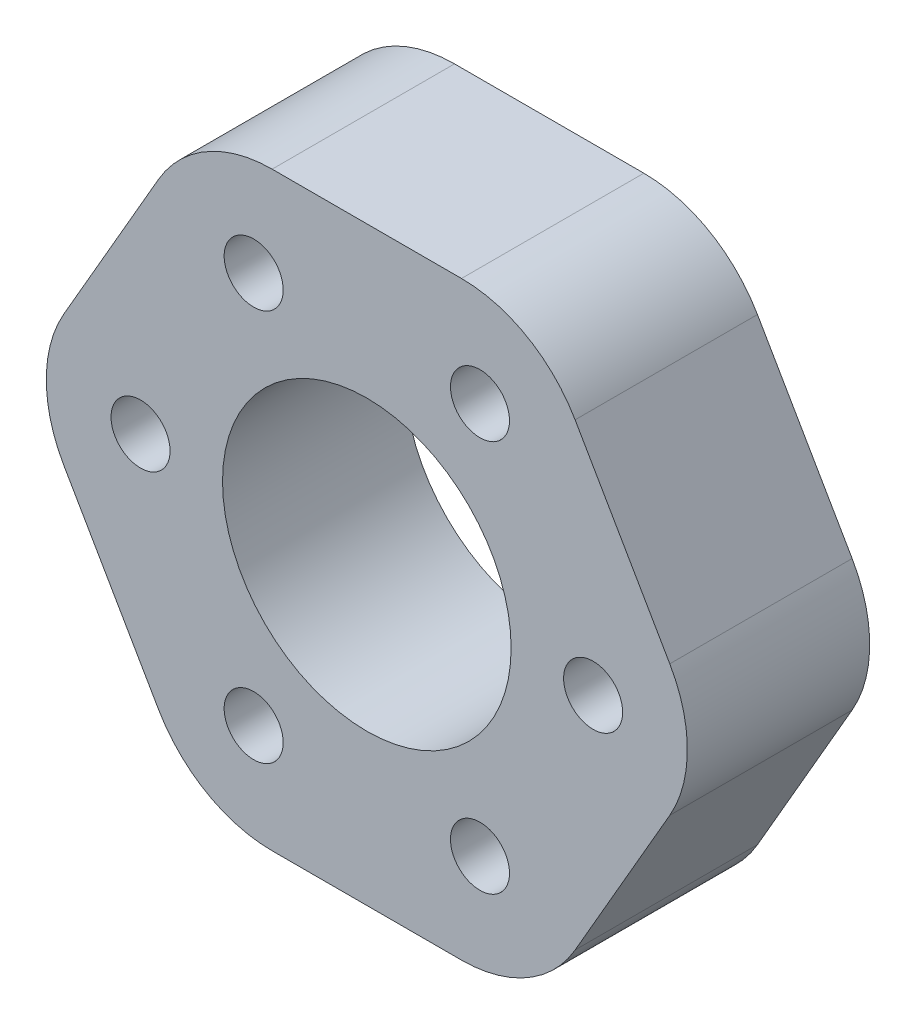
ISO-10303-21;
HEADER;
FILE_DESCRIPTION(('STEP AP214'),'2;1');
FILE_NAME('part.step','',(''),(''),'','','');
FILE_SCHEMA(('AUTOMOTIVE_DESIGN { 1 0 10303 214 1 1 1 1 }'));
ENDSEC;
DATA;
#1=APPLICATION_CONTEXT('core data for automotive mechanical design processes');
#2=APPLICATION_PROTOCOL_DEFINITION('international standard','automotive_design',2000,#1);
#3=PRODUCT_CONTEXT('',#1,'mechanical');
#4=PRODUCT('Part','Part','',(#3));
#5=PRODUCT_RELATED_PRODUCT_CATEGORY('part','',(#4));
#6=PRODUCT_DEFINITION_FORMATION('','',#4);
#7=PRODUCT_DEFINITION_CONTEXT('part definition',#1,'design');
#8=PRODUCT_DEFINITION('design','',#6,#7);
#9=PRODUCT_DEFINITION_SHAPE('','',#8);
#10=(LENGTH_UNIT() NAMED_UNIT(*) SI_UNIT(.MILLI.,.METRE.));
#11=(NAMED_UNIT(*) PLANE_ANGLE_UNIT() SI_UNIT($,.RADIAN.));
#12=(NAMED_UNIT(*) SI_UNIT($,.STERADIAN.) SOLID_ANGLE_UNIT());
#13=UNCERTAINTY_MEASURE_WITH_UNIT(LENGTH_MEASURE(1.E-05),#10,'distance_accuracy_value','');
#14=(GEOMETRIC_REPRESENTATION_CONTEXT(3) GLOBAL_UNCERTAINTY_ASSIGNED_CONTEXT((#13)) GLOBAL_UNIT_ASSIGNED_CONTEXT((#10,
#11,#12)) REPRESENTATION_CONTEXT('',''));
#15=CARTESIAN_POINT('',(0.,0.,0.));
#16=DIRECTION('',(0.,0.,1.));
#17=DIRECTION('',(1.,0.,0.));
#18=AXIS2_PLACEMENT_3D('',#15,#16,#17);
#19=CARTESIAN_POINT('',(0.,0.,13.9));
#20=DIRECTION('',(0.,0.,1.));
#21=DIRECTION('',(1.,0.,0.));
#22=AXIS2_PLACEMENT_3D('',#19,#20,#21);
#23=PLANE('',#22);
#24=CARTESIAN_POINT('',(-8.62500000000017,-14.9389382152815,13.9));
#25=DIRECTION('',(0.,0.,1.));
#26=DIRECTION('',(1.,0.,0.));
#27=AXIS2_PLACEMENT_3D('',#24,#25,#26);
#28=CIRCLE('',#27,2.25);
#29=CARTESIAN_POINT('',(-6.37500000000017,-14.9389382152815,13.9));
#30=VERTEX_POINT('',#29);
#31=EDGE_CURVE('E268',#30,#30,#28,.T.);
#32=ORIENTED_EDGE('',*,*,#31,.F.);
#33=EDGE_LOOP('',(#32));
#34=FACE_BOUND('',#33,.T.);
#35=CARTESIAN_POINT('',(17.25,-1.20456106190088E-13,13.9));
#36=DIRECTION('',(0.,0.,1.));
#37=DIRECTION('',(1.,0.,0.));
#38=AXIS2_PLACEMENT_3D('',#35,#36,#37);
#39=CIRCLE('',#38,2.25);
#40=CARTESIAN_POINT('',(19.5,-1.20456106190088E-13,13.9));
#41=VERTEX_POINT('',#40);
#42=EDGE_CURVE('E284',#41,#41,#39,.T.);
#43=ORIENTED_EDGE('',*,*,#42,.F.);
#44=EDGE_LOOP('',(#43));
#45=FACE_BOUND('',#44,.T.);
#46=CARTESIAN_POINT('',(-8.62499999999997,14.9389382152816,13.9));
#47=DIRECTION('',(0.,0.,1.));
#48=DIRECTION('',(1.,0.,0.));
#49=AXIS2_PLACEMENT_3D('',#46,#47,#48);
#50=CIRCLE('',#49,2.25);
#51=CARTESIAN_POINT('',(-6.37499999999997,14.9389382152816,13.9));
#52=VERTEX_POINT('',#51);
#53=EDGE_CURVE('E300',#52,#52,#50,.T.);
#54=ORIENTED_EDGE('',*,*,#53,.F.);
#55=EDGE_LOOP('',(#54));
#56=FACE_BOUND('',#55,.T.);
#57=CARTESIAN_POINT('',(-17.25,0.,13.9));
#58=DIRECTION('',(0.,0.,1.));
#59=DIRECTION('',(1.,0.,0.));
#60=AXIS2_PLACEMENT_3D('',#57,#58,#59);
#61=CIRCLE('',#60,2.25);
#62=CARTESIAN_POINT('',(-15.,0.,13.9));
#63=VERTEX_POINT('',#62);
#64=EDGE_CURVE('E165',#63,#63,#61,.T.);
#65=ORIENTED_EDGE('',*,*,#64,.F.);
#66=EDGE_LOOP('',(#65));
#67=FACE_BOUND('',#66,.T.);
#68=CARTESIAN_POINT('',(8.62500000000007,14.9389382152815,13.9));
#69=DIRECTION('',(0.,0.,1.));
#70=DIRECTION('',(1.,0.,0.));
#71=AXIS2_PLACEMENT_3D('',#68,#69,#70);
#72=CIRCLE('',#71,2.25);
#73=CARTESIAN_POINT('',(10.8750000000001,14.9389382152815,13.9));
#74=VERTEX_POINT('',#73);
#75=EDGE_CURVE('E292',#74,#74,#72,.T.);
#76=ORIENTED_EDGE('',*,*,#75,.F.);
#77=EDGE_LOOP('',(#76));
#78=FACE_BOUND('',#77,.T.);
#79=CARTESIAN_POINT('',(8.62499999999986,-14.9389382152817,13.9));
#80=DIRECTION('',(0.,0.,1.));
#81=DIRECTION('',(1.,0.,0.));
#82=AXIS2_PLACEMENT_3D('',#79,#80,#81);
#83=CIRCLE('',#82,2.25);
#84=CARTESIAN_POINT('',(10.8749999999999,-14.9389382152817,13.9));
#85=VERTEX_POINT('',#84);
#86=EDGE_CURVE('E276',#85,#85,#83,.T.);
#87=ORIENTED_EDGE('',*,*,#86,.F.);
#88=EDGE_LOOP('',(#87));
#89=FACE_BOUND('',#88,.T.);
#90=CARTESIAN_POINT('',(0.,0.,13.9));
#91=DIRECTION('',(0.,0.,1.));
#92=DIRECTION('',(1.,0.,0.));
#93=AXIS2_PLACEMENT_3D('',#90,#91,#92);
#94=CIRCLE('',#93,11.);
#95=CARTESIAN_POINT('',(11.,0.,13.9));
#96=VERTEX_POINT('',#95);
#97=EDGE_CURVE('E158',#96,#96,#94,.T.);
#98=ORIENTED_EDGE('',*,*,#97,.F.);
#99=EDGE_LOOP('',(#98));
#100=FACE_BOUND('',#99,.T.);
#101=DIRECTION('',(-0.5,0.866025403784438,0.));
#102=VECTOR('',#101,1.);
#103=CARTESIAN_POINT('',(25.9807621135332,0.,13.9));
#104=LINE('',#103,#102);
#105=CARTESIAN_POINT('',(23.094010767585,5.00000000000002,13.9));
#106=VERTEX_POINT('',#105);
#107=CARTESIAN_POINT('',(15.8771324027147,17.5,13.9));
#108=VERTEX_POINT('',#107);
#109=EDGE_CURVE('E138',#106,#108,#104,.T.);
#110=ORIENTED_EDGE('',*,*,#109,.T.);
#111=CARTESIAN_POINT('',(7.21687836487032,12.5,13.9));
#112=DIRECTION('',(0.,0.,1.));
#113=DIRECTION('',(1.,0.,0.));
#114=AXIS2_PLACEMENT_3D('',#111,#112,#113);
#115=CIRCLE('',#114,10.);
#116=CARTESIAN_POINT('',(7.21687836487032,22.5,13.9));
#117=VERTEX_POINT('',#116);
#118=EDGE_CURVE('E185',#108,#117,#115,.T.);
#119=ORIENTED_EDGE('',*,*,#118,.T.);
#120=DIRECTION('',(-1.,0.,0.));
#121=VECTOR('',#120,1.);
#122=CARTESIAN_POINT('',(12.9903810567666,22.5,13.9));
#123=LINE('',#122,#121);
#124=CARTESIAN_POINT('',(-7.21687836487031,22.5,13.9));
#125=VERTEX_POINT('',#124);
#126=EDGE_CURVE('E159',#117,#125,#123,.T.);
#127=ORIENTED_EDGE('',*,*,#126,.T.);
#128=CARTESIAN_POINT('',(-7.21687836487032,12.5,13.9));
#129=DIRECTION('',(0.,0.,1.));
#130=DIRECTION('',(1.,0.,0.));
#131=AXIS2_PLACEMENT_3D('',#128,#129,#130);
#132=CIRCLE('',#131,10.);
#133=CARTESIAN_POINT('',(-15.8771324027147,17.5,13.9));
#134=VERTEX_POINT('',#133);
#135=EDGE_CURVE('E182',#125,#134,#132,.T.);
#136=ORIENTED_EDGE('',*,*,#135,.T.);
#137=DIRECTION('',(-0.5,-0.866025403784439,0.));
#138=VECTOR('',#137,1.);
#139=CARTESIAN_POINT('',(-12.9903810567666,22.5,13.9));
#140=LINE('',#139,#138);
#141=CARTESIAN_POINT('',(-23.094010767585,5.,13.9));
#142=VERTEX_POINT('',#141);
#143=EDGE_CURVE('E375',#134,#142,#140,.T.);
#144=ORIENTED_EDGE('',*,*,#143,.T.);
#145=CARTESIAN_POINT('',(-14.4337567297406,0.,13.9));
#146=DIRECTION('',(0.,0.,1.));
#147=DIRECTION('',(1.,0.,0.));
#148=AXIS2_PLACEMENT_3D('',#145,#146,#147);
#149=CIRCLE('',#148,10.);
#150=CARTESIAN_POINT('',(-23.094010767585,-4.99999999999999,13.9));
#151=VERTEX_POINT('',#150);
#152=EDGE_CURVE('E179',#142,#151,#149,.T.);
#153=ORIENTED_EDGE('',*,*,#152,.T.);
#154=DIRECTION('',(0.5,-0.866025403784439,0.));
#155=VECTOR('',#154,1.);
#156=CARTESIAN_POINT('',(-25.9807621135332,0.,13.9));
#157=LINE('',#156,#155);
#158=CARTESIAN_POINT('',(-15.8771324027147,-17.5,13.9));
#159=VERTEX_POINT('',#158);
#160=EDGE_CURVE('E371',#151,#159,#157,.T.);
#161=ORIENTED_EDGE('',*,*,#160,.T.);
#162=CARTESIAN_POINT('',(-7.21687836487032,-12.5,13.9));
#163=DIRECTION('',(0.,0.,1.));
#164=DIRECTION('',(1.,0.,0.));
#165=AXIS2_PLACEMENT_3D('',#162,#163,#164);
#166=CIRCLE('',#165,10.);
#167=CARTESIAN_POINT('',(-7.21687836487032,-22.5,13.9));
#168=VERTEX_POINT('',#167);
#169=EDGE_CURVE('E147',#159,#168,#166,.T.);
#170=ORIENTED_EDGE('',*,*,#169,.T.);
#171=DIRECTION('',(1.,0.,0.));
#172=VECTOR('',#171,1.);
#173=CARTESIAN_POINT('',(-12.9903810567666,-22.5,13.9));
#174=LINE('',#173,#172);
#175=CARTESIAN_POINT('',(7.21687836487032,-22.5,13.9));
#176=VERTEX_POINT('',#175);
#177=EDGE_CURVE('E381',#168,#176,#174,.T.);
#178=ORIENTED_EDGE('',*,*,#177,.T.);
#179=CARTESIAN_POINT('',(7.21687836487032,-12.5,13.9));
#180=DIRECTION('',(0.,0.,1.));
#181=DIRECTION('',(1.,0.,0.));
#182=AXIS2_PLACEMENT_3D('',#179,#180,#181);
#183=CIRCLE('',#182,10.);
#184=CARTESIAN_POINT('',(15.8771324027147,-17.5,13.9));
#185=VERTEX_POINT('',#184);
#186=EDGE_CURVE('E146',#176,#185,#183,.T.);
#187=ORIENTED_EDGE('',*,*,#186,.T.);
#188=DIRECTION('',(0.5,0.866025403784439,0.));
#189=VECTOR('',#188,1.);
#190=CARTESIAN_POINT('',(12.9903810567666,-22.5,13.9));
#191=LINE('',#190,#189);
#192=CARTESIAN_POINT('',(23.094010767585,-4.99999999999999,13.9));
#193=VERTEX_POINT('',#192);
#194=EDGE_CURVE('E140',#185,#193,#191,.T.);
#195=ORIENTED_EDGE('',*,*,#194,.T.);
#196=CARTESIAN_POINT('',(14.4337567297406,0.,13.9));
#197=DIRECTION('',(0.,0.,1.));
#198=DIRECTION('',(1.,0.,0.));
#199=AXIS2_PLACEMENT_3D('',#196,#197,#198);
#200=CIRCLE('',#199,10.);
#201=EDGE_CURVE('E136',#193,#106,#200,.T.);
#202=ORIENTED_EDGE('',*,*,#201,.T.);
#203=EDGE_LOOP('',(#110,#119,#127,#136,#144,#153,#161,#170,#178,#187,#195,#202));
#204=FACE_BOUND('',#203,.T.);
#205=ADVANCED_FACE('F45',(#34,#45,#56,#67,#78,#89,#100,#204),#23,.T.);
#206=CARTESIAN_POINT('',(0.,0.,0.));
#207=DIRECTION('',(0.,0.,1.));
#208=DIRECTION('',(1.,0.,0.));
#209=AXIS2_PLACEMENT_3D('',#206,#207,#208);
#210=PLANE('',#209);
#211=CARTESIAN_POINT('',(-8.62500000000017,-14.9389382152815,0.));
#212=DIRECTION('',(0.,0.,1.));
#213=DIRECTION('',(1.,0.,0.));
#214=AXIS2_PLACEMENT_3D('',#211,#212,#213);
#215=CIRCLE('',#214,2.25);
#216=CARTESIAN_POINT('',(-6.37500000000017,-14.9389382152815,0.));
#217=VERTEX_POINT('',#216);
#218=EDGE_CURVE('E264',#217,#217,#215,.T.);
#219=ORIENTED_EDGE('',*,*,#218,.T.);
#220=EDGE_LOOP('',(#219));
#221=FACE_BOUND('',#220,.T.);
#222=CARTESIAN_POINT('',(8.62499999999986,-14.9389382152817,0.));
#223=DIRECTION('',(0.,0.,1.));
#224=DIRECTION('',(1.,0.,0.));
#225=AXIS2_PLACEMENT_3D('',#222,#223,#224);
#226=CIRCLE('',#225,2.25);
#227=CARTESIAN_POINT('',(10.8749999999999,-14.9389382152817,0.));
#228=VERTEX_POINT('',#227);
#229=EDGE_CURVE('E272',#228,#228,#226,.T.);
#230=ORIENTED_EDGE('',*,*,#229,.T.);
#231=EDGE_LOOP('',(#230));
#232=FACE_BOUND('',#231,.T.);
#233=CARTESIAN_POINT('',(17.25,-1.20456106190088E-13,0.));
#234=DIRECTION('',(0.,0.,1.));
#235=DIRECTION('',(1.,0.,0.));
#236=AXIS2_PLACEMENT_3D('',#233,#234,#235);
#237=CIRCLE('',#236,2.25);
#238=CARTESIAN_POINT('',(19.5,-1.20456106190088E-13,0.));
#239=VERTEX_POINT('',#238);
#240=EDGE_CURVE('E280',#239,#239,#237,.T.);
#241=ORIENTED_EDGE('',*,*,#240,.T.);
#242=EDGE_LOOP('',(#241));
#243=FACE_BOUND('',#242,.T.);
#244=CARTESIAN_POINT('',(8.62500000000007,14.9389382152815,0.));
#245=DIRECTION('',(0.,0.,1.));
#246=DIRECTION('',(1.,0.,0.));
#247=AXIS2_PLACEMENT_3D('',#244,#245,#246);
#248=CIRCLE('',#247,2.25);
#249=CARTESIAN_POINT('',(10.8750000000001,14.9389382152815,0.));
#250=VERTEX_POINT('',#249);
#251=EDGE_CURVE('E288',#250,#250,#248,.T.);
#252=ORIENTED_EDGE('',*,*,#251,.T.);
#253=EDGE_LOOP('',(#252));
#254=FACE_BOUND('',#253,.T.);
#255=CARTESIAN_POINT('',(-8.62499999999997,14.9389382152816,0.));
#256=DIRECTION('',(0.,0.,1.));
#257=DIRECTION('',(1.,0.,0.));
#258=AXIS2_PLACEMENT_3D('',#255,#256,#257);
#259=CIRCLE('',#258,2.25);
#260=CARTESIAN_POINT('',(-6.37499999999997,14.9389382152816,0.));
#261=VERTEX_POINT('',#260);
#262=EDGE_CURVE('E296',#261,#261,#259,.T.);
#263=ORIENTED_EDGE('',*,*,#262,.T.);
#264=EDGE_LOOP('',(#263));
#265=FACE_BOUND('',#264,.T.);
#266=CARTESIAN_POINT('',(-17.25,0.,0.));
#267=DIRECTION('',(0.,0.,1.));
#268=DIRECTION('',(1.,0.,0.));
#269=AXIS2_PLACEMENT_3D('',#266,#267,#268);
#270=CIRCLE('',#269,2.25);
#271=CARTESIAN_POINT('',(-15.,0.,0.));
#272=VERTEX_POINT('',#271);
#273=EDGE_CURVE('E171',#272,#272,#270,.T.);
#274=ORIENTED_EDGE('',*,*,#273,.T.);
#275=EDGE_LOOP('',(#274));
#276=FACE_BOUND('',#275,.T.);
#277=CARTESIAN_POINT('',(0.,0.,0.));
#278=DIRECTION('',(0.,0.,1.));
#279=DIRECTION('',(1.,0.,0.));
#280=AXIS2_PLACEMENT_3D('',#277,#278,#279);
#281=CIRCLE('',#280,11.);
#282=CARTESIAN_POINT('',(11.,0.,0.));
#283=VERTEX_POINT('',#282);
#284=EDGE_CURVE('E260',#283,#283,#281,.T.);
#285=ORIENTED_EDGE('',*,*,#284,.T.);
#286=EDGE_LOOP('',(#285));
#287=FACE_BOUND('',#286,.T.);
#288=DIRECTION('',(-1.,0.,0.));
#289=VECTOR('',#288,1.);
#290=CARTESIAN_POINT('',(12.9903810567666,22.5,0.));
#291=LINE('',#290,#289);
#292=CARTESIAN_POINT('',(7.21687836487032,22.5,0.));
#293=VERTEX_POINT('',#292);
#294=CARTESIAN_POINT('',(-7.21687836487031,22.5,0.));
#295=VERTEX_POINT('',#294);
#296=EDGE_CURVE('E253',#293,#295,#291,.T.);
#297=ORIENTED_EDGE('',*,*,#296,.F.);
#298=CARTESIAN_POINT('',(7.21687836487032,12.5,0.));
#299=DIRECTION('',(0.,0.,1.));
#300=DIRECTION('',(1.,0.,0.));
#301=AXIS2_PLACEMENT_3D('',#298,#299,#300);
#302=CIRCLE('',#301,10.);
#303=CARTESIAN_POINT('',(15.8771324027147,17.5,0.));
#304=VERTEX_POINT('',#303);
#305=EDGE_CURVE('E208',#293,#304,#302,.F.);
#306=ORIENTED_EDGE('',*,*,#305,.T.);
#307=DIRECTION('',(-0.5,0.866025403784438,0.));
#308=VECTOR('',#307,1.);
#309=CARTESIAN_POINT('',(25.9807621135332,0.,0.));
#310=LINE('',#309,#308);
#311=CARTESIAN_POINT('',(23.094010767585,5.00000000000002,0.));
#312=VERTEX_POINT('',#311);
#313=EDGE_CURVE('E257',#312,#304,#310,.T.);
#314=ORIENTED_EDGE('',*,*,#313,.F.);
#315=CARTESIAN_POINT('',(14.4337567297406,0.,0.));
#316=DIRECTION('',(0.,0.,1.));
#317=DIRECTION('',(1.,0.,0.));
#318=AXIS2_PLACEMENT_3D('',#315,#316,#317);
#319=CIRCLE('',#318,10.);
#320=CARTESIAN_POINT('',(23.094010767585,-4.99999999999999,0.));
#321=VERTEX_POINT('',#320);
#322=EDGE_CURVE('E163',#312,#321,#319,.F.);
#323=ORIENTED_EDGE('',*,*,#322,.T.);
#324=DIRECTION('',(0.5,0.866025403784439,0.));
#325=VECTOR('',#324,1.);
#326=CARTESIAN_POINT('',(12.9903810567666,-22.5,0.));
#327=LINE('',#326,#325);
#328=CARTESIAN_POINT('',(15.8771324027147,-17.5,0.));
#329=VERTEX_POINT('',#328);
#330=EDGE_CURVE('E236',#329,#321,#327,.T.);
#331=ORIENTED_EDGE('',*,*,#330,.F.);
#332=CARTESIAN_POINT('',(7.21687836487032,-12.5,0.));
#333=DIRECTION('',(0.,0.,1.));
#334=DIRECTION('',(1.,0.,0.));
#335=AXIS2_PLACEMENT_3D('',#332,#333,#334);
#336=CIRCLE('',#335,10.);
#337=CARTESIAN_POINT('',(7.21687836487032,-22.5,0.));
#338=VERTEX_POINT('',#337);
#339=EDGE_CURVE('E200',#329,#338,#336,.F.);
#340=ORIENTED_EDGE('',*,*,#339,.T.);
#341=DIRECTION('',(1.,0.,0.));
#342=VECTOR('',#341,1.);
#343=CARTESIAN_POINT('',(-12.9903810567666,-22.5,0.));
#344=LINE('',#343,#342);
#345=CARTESIAN_POINT('',(-7.21687836487032,-22.5,0.));
#346=VERTEX_POINT('',#345);
#347=EDGE_CURVE('E239',#346,#338,#344,.T.);
#348=ORIENTED_EDGE('',*,*,#347,.F.);
#349=CARTESIAN_POINT('',(-7.21687836487032,-12.5,0.));
#350=DIRECTION('',(0.,0.,1.));
#351=DIRECTION('',(1.,0.,0.));
#352=AXIS2_PLACEMENT_3D('',#349,#350,#351);
#353=CIRCLE('',#352,10.);
#354=CARTESIAN_POINT('',(-15.8771324027147,-17.5,0.));
#355=VERTEX_POINT('',#354);
#356=EDGE_CURVE('E195',#346,#355,#353,.F.);
#357=ORIENTED_EDGE('',*,*,#356,.T.);
#358=DIRECTION('',(0.5,-0.866025403784439,0.));
#359=VECTOR('',#358,1.);
#360=CARTESIAN_POINT('',(-25.9807621135332,0.,0.));
#361=LINE('',#360,#359);
#362=CARTESIAN_POINT('',(-23.094010767585,-4.99999999999999,0.));
#363=VERTEX_POINT('',#362);
#364=EDGE_CURVE('E243',#363,#355,#361,.T.);
#365=ORIENTED_EDGE('',*,*,#364,.F.);
#366=CARTESIAN_POINT('',(-14.4337567297406,0.,0.));
#367=DIRECTION('',(0.,0.,1.));
#368=DIRECTION('',(1.,0.,0.));
#369=AXIS2_PLACEMENT_3D('',#366,#367,#368);
#370=CIRCLE('',#369,10.);
#371=CARTESIAN_POINT('',(-23.094010767585,5.,0.));
#372=VERTEX_POINT('',#371);
#373=EDGE_CURVE('E61',#363,#372,#370,.F.);
#374=ORIENTED_EDGE('',*,*,#373,.T.);
#375=DIRECTION('',(-0.5,-0.866025403784439,0.));
#376=VECTOR('',#375,1.);
#377=CARTESIAN_POINT('',(-12.9903810567666,22.5,0.));
#378=LINE('',#377,#376);
#379=CARTESIAN_POINT('',(-15.8771324027147,17.5,0.));
#380=VERTEX_POINT('',#379);
#381=EDGE_CURVE('E250',#380,#372,#378,.T.);
#382=ORIENTED_EDGE('',*,*,#381,.F.);
#383=CARTESIAN_POINT('',(-7.21687836487032,12.5,0.));
#384=DIRECTION('',(0.,0.,1.));
#385=DIRECTION('',(1.,0.,0.));
#386=AXIS2_PLACEMENT_3D('',#383,#384,#385);
#387=CIRCLE('',#386,10.);
#388=EDGE_CURVE('E205',#380,#295,#387,.F.);
#389=ORIENTED_EDGE('',*,*,#388,.T.);
#390=EDGE_LOOP('',(#297,#306,#314,#323,#331,#340,#348,#357,#365,#374,#382,#389));
#391=FACE_BOUND('',#390,.T.);
#392=ADVANCED_FACE('F308',(#221,#232,#243,#254,#265,#276,#287,#391),#210,.F.);
#393=CARTESIAN_POINT('',(-17.25,0.,13.9));
#394=DIRECTION('',(0.,0.,-1.));
#395=DIRECTION('',(-1.,0.,0.));
#396=AXIS2_PLACEMENT_3D('',#393,#394,#395);
#397=CYLINDRICAL_SURFACE('',#396,2.25);
#398=ORIENTED_EDGE('',*,*,#64,.T.);
#399=EDGE_LOOP('',(#398));
#400=FACE_BOUND('',#399,.T.);
#401=ORIENTED_EDGE('',*,*,#273,.F.);
#402=EDGE_LOOP('',(#401));
#403=FACE_BOUND('',#402,.T.);
#404=ADVANCED_FACE('F314',(#400,#403),#397,.F.);
#405=CARTESIAN_POINT('',(-8.62499999999997,14.9389382152816,13.9));
#406=DIRECTION('',(0.,0.,-1.));
#407=DIRECTION('',(-1.,0.,0.));
#408=AXIS2_PLACEMENT_3D('',#405,#406,#407);
#409=CYLINDRICAL_SURFACE('',#408,2.25);
#410=ORIENTED_EDGE('',*,*,#53,.T.);
#411=EDGE_LOOP('',(#410));
#412=FACE_BOUND('',#411,.T.);
#413=ORIENTED_EDGE('',*,*,#262,.F.);
#414=EDGE_LOOP('',(#413));
#415=FACE_BOUND('',#414,.T.);
#416=ADVANCED_FACE('F311',(#412,#415),#409,.F.);
#417=CARTESIAN_POINT('',(8.62500000000007,14.9389382152815,13.9));
#418=DIRECTION('',(0.,0.,-1.));
#419=DIRECTION('',(-1.,0.,0.));
#420=AXIS2_PLACEMENT_3D('',#417,#418,#419);
#421=CYLINDRICAL_SURFACE('',#420,2.25);
#422=ORIENTED_EDGE('',*,*,#75,.T.);
#423=EDGE_LOOP('',(#422));
#424=FACE_BOUND('',#423,.T.);
#425=ORIENTED_EDGE('',*,*,#251,.F.);
#426=EDGE_LOOP('',(#425));
#427=FACE_BOUND('',#426,.T.);
#428=ADVANCED_FACE('F313',(#424,#427),#421,.F.);
#429=CARTESIAN_POINT('',(17.25,-1.20456106190088E-13,13.9));
#430=DIRECTION('',(0.,0.,-1.));
#431=DIRECTION('',(-1.,0.,0.));
#432=AXIS2_PLACEMENT_3D('',#429,#430,#431);
#433=CYLINDRICAL_SURFACE('',#432,2.25);
#434=ORIENTED_EDGE('',*,*,#42,.T.);
#435=EDGE_LOOP('',(#434));
#436=FACE_BOUND('',#435,.T.);
#437=ORIENTED_EDGE('',*,*,#240,.F.);
#438=EDGE_LOOP('',(#437));
#439=FACE_BOUND('',#438,.T.);
#440=ADVANCED_FACE('F321',(#436,#439),#433,.F.);
#441=CARTESIAN_POINT('',(8.62499999999986,-14.9389382152817,13.9));
#442=DIRECTION('',(0.,0.,-1.));
#443=DIRECTION('',(-1.,0.,0.));
#444=AXIS2_PLACEMENT_3D('',#441,#442,#443);
#445=CYLINDRICAL_SURFACE('',#444,2.25);
#446=ORIENTED_EDGE('',*,*,#86,.T.);
#447=EDGE_LOOP('',(#446));
#448=FACE_BOUND('',#447,.T.);
#449=ORIENTED_EDGE('',*,*,#229,.F.);
#450=EDGE_LOOP('',(#449));
#451=FACE_BOUND('',#450,.T.);
#452=ADVANCED_FACE('F408',(#448,#451),#445,.F.);
#453=CARTESIAN_POINT('',(-8.62500000000017,-14.9389382152815,13.9));
#454=DIRECTION('',(0.,0.,-1.));
#455=DIRECTION('',(-1.,0.,0.));
#456=AXIS2_PLACEMENT_3D('',#453,#454,#455);
#457=CYLINDRICAL_SURFACE('',#456,2.25);
#458=ORIENTED_EDGE('',*,*,#31,.T.);
#459=EDGE_LOOP('',(#458));
#460=FACE_BOUND('',#459,.T.);
#461=ORIENTED_EDGE('',*,*,#218,.F.);
#462=EDGE_LOOP('',(#461));
#463=FACE_BOUND('',#462,.T.);
#464=ADVANCED_FACE('F404',(#460,#463),#457,.F.);
#465=CARTESIAN_POINT('',(0.,0.,0.));
#466=DIRECTION('',(0.,0.,1.));
#467=DIRECTION('',(1.,0.,0.));
#468=AXIS2_PLACEMENT_3D('',#465,#466,#467);
#469=CYLINDRICAL_SURFACE('',#468,11.);
#470=ORIENTED_EDGE('',*,*,#284,.F.);
#471=EDGE_LOOP('',(#470));
#472=FACE_BOUND('',#471,.T.);
#473=ORIENTED_EDGE('',*,*,#97,.T.);
#474=EDGE_LOOP('',(#473));
#475=FACE_BOUND('',#474,.T.);
#476=ADVANCED_FACE('F402',(#472,#475),#469,.F.);
#477=CARTESIAN_POINT('',(25.9807621135332,0.,0.));
#478=DIRECTION('',(0.866025403784438,0.5,0.));
#479=DIRECTION('',(-0.5,0.866025403784438,0.));
#480=AXIS2_PLACEMENT_3D('',#477,#478,#479);
#481=PLANE('',#480);
#482=ORIENTED_EDGE('',*,*,#313,.T.);
#483=DIRECTION('',(0.,0.,1.));
#484=VECTOR('',#483,1.);
#485=CARTESIAN_POINT('',(15.8771324027147,17.5,0.));
#486=LINE('',#485,#484);
#487=EDGE_CURVE('E156',#304,#108,#486,.T.);
#488=ORIENTED_EDGE('',*,*,#487,.T.);
#489=ORIENTED_EDGE('',*,*,#109,.F.);
#490=DIRECTION('',(0.,0.,1.));
#491=VECTOR('',#490,1.);
#492=CARTESIAN_POINT('',(23.094010767585,5.00000000000002,0.));
#493=LINE('',#492,#491);
#494=EDGE_CURVE('E153',#106,#312,#493,.F.);
#495=ORIENTED_EDGE('',*,*,#494,.T.);
#496=EDGE_LOOP('',(#482,#488,#489,#495));
#497=FACE_BOUND('',#496,.T.);
#498=ADVANCED_FACE('F152',(#497),#481,.T.);
#499=CARTESIAN_POINT('',(12.9903810567666,-22.5,0.));
#500=DIRECTION('',(0.866025403784439,-0.5,0.));
#501=DIRECTION('',(0.5,0.866025403784439,0.));
#502=AXIS2_PLACEMENT_3D('',#499,#500,#501);
#503=PLANE('',#502);
#504=ORIENTED_EDGE('',*,*,#194,.F.);
#505=DIRECTION('',(0.,0.,1.));
#506=VECTOR('',#505,1.);
#507=CARTESIAN_POINT('',(15.8771324027147,-17.5,0.));
#508=LINE('',#507,#506);
#509=EDGE_CURVE('E12',#185,#329,#508,.F.);
#510=ORIENTED_EDGE('',*,*,#509,.T.);
#511=ORIENTED_EDGE('',*,*,#330,.T.);
#512=DIRECTION('',(0.,0.,1.));
#513=VECTOR('',#512,1.);
#514=CARTESIAN_POINT('',(23.094010767585,-4.99999999999999,0.));
#515=LINE('',#514,#513);
#516=EDGE_CURVE('E54',#321,#193,#515,.T.);
#517=ORIENTED_EDGE('',*,*,#516,.T.);
#518=EDGE_LOOP('',(#504,#510,#511,#517));
#519=FACE_BOUND('',#518,.T.);
#520=ADVANCED_FACE('F233',(#519),#503,.T.);
#521=CARTESIAN_POINT('',(-12.9903810567666,-22.5,0.));
#522=DIRECTION('',(0.,-1.,0.));
#523=DIRECTION('',(0.,0.,-1.));
#524=AXIS2_PLACEMENT_3D('',#521,#522,#523);
#525=PLANE('',#524);
#526=ORIENTED_EDGE('',*,*,#347,.T.);
#527=DIRECTION('',(0.,0.,1.));
#528=VECTOR('',#527,1.);
#529=CARTESIAN_POINT('',(7.21687836487032,-22.5,0.));
#530=LINE('',#529,#528);
#531=EDGE_CURVE('E227',#338,#176,#530,.T.);
#532=ORIENTED_EDGE('',*,*,#531,.T.);
#533=ORIENTED_EDGE('',*,*,#177,.F.);
#534=DIRECTION('',(0.,0.,1.));
#535=VECTOR('',#534,1.);
#536=CARTESIAN_POINT('',(-7.21687836487032,-22.5,0.));
#537=LINE('',#536,#535);
#538=EDGE_CURVE('E224',#168,#346,#537,.F.);
#539=ORIENTED_EDGE('',*,*,#538,.T.);
#540=EDGE_LOOP('',(#526,#532,#533,#539));
#541=FACE_BOUND('',#540,.T.);
#542=ADVANCED_FACE('F390',(#541),#525,.T.);
#543=CARTESIAN_POINT('',(-25.9807621135332,0.,0.));
#544=DIRECTION('',(-0.866025403784439,-0.5,0.));
#545=DIRECTION('',(0.5,-0.866025403784439,0.));
#546=AXIS2_PLACEMENT_3D('',#543,#544,#545);
#547=PLANE('',#546);
#548=ORIENTED_EDGE('',*,*,#160,.F.);
#549=DIRECTION('',(0.,0.,1.));
#550=VECTOR('',#549,1.);
#551=CARTESIAN_POINT('',(-23.094010767585,-4.99999999999999,0.));
#552=LINE('',#551,#550);
#553=EDGE_CURVE('E221',#151,#363,#552,.F.);
#554=ORIENTED_EDGE('',*,*,#553,.T.);
#555=ORIENTED_EDGE('',*,*,#364,.T.);
#556=DIRECTION('',(0.,0.,1.));
#557=VECTOR('',#556,1.);
#558=CARTESIAN_POINT('',(-15.8771324027147,-17.5,0.));
#559=LINE('',#558,#557);
#560=EDGE_CURVE('E217',#355,#159,#559,.T.);
#561=ORIENTED_EDGE('',*,*,#560,.T.);
#562=EDGE_LOOP('',(#548,#554,#555,#561));
#563=FACE_BOUND('',#562,.T.);
#564=ADVANCED_FACE('F368',(#563),#547,.T.);
#565=CARTESIAN_POINT('',(-12.9903810567666,22.5,0.));
#566=DIRECTION('',(-0.866025403784439,0.5,0.));
#567=DIRECTION('',(-0.5,-0.866025403784439,0.));
#568=AXIS2_PLACEMENT_3D('',#565,#566,#567);
#569=PLANE('',#568);
#570=ORIENTED_EDGE('',*,*,#143,.F.);
#571=DIRECTION('',(0.,0.,1.));
#572=VECTOR('',#571,1.);
#573=CARTESIAN_POINT('',(-15.8771324027147,17.5,0.));
#574=LINE('',#573,#572);
#575=EDGE_CURVE('E68',#134,#380,#574,.F.);
#576=ORIENTED_EDGE('',*,*,#575,.T.);
#577=ORIENTED_EDGE('',*,*,#381,.T.);
#578=DIRECTION('',(0.,0.,1.));
#579=VECTOR('',#578,1.);
#580=CARTESIAN_POINT('',(-23.094010767585,5.,0.));
#581=LINE('',#580,#579);
#582=EDGE_CURVE('E211',#372,#142,#581,.T.);
#583=ORIENTED_EDGE('',*,*,#582,.T.);
#584=EDGE_LOOP('',(#570,#576,#577,#583));
#585=FACE_BOUND('',#584,.T.);
#586=ADVANCED_FACE('F374',(#585),#569,.T.);
#587=CARTESIAN_POINT('',(12.9903810567666,22.5,0.));
#588=DIRECTION('',(0.,1.,0.));
#589=DIRECTION('',(0.,0.,1.));
#590=AXIS2_PLACEMENT_3D('',#587,#588,#589);
#591=PLANE('',#590);
#592=ORIENTED_EDGE('',*,*,#126,.F.);
#593=DIRECTION('',(0.,0.,1.));
#594=VECTOR('',#593,1.);
#595=CARTESIAN_POINT('',(7.21687836487032,22.5,0.));
#596=LINE('',#595,#594);
#597=EDGE_CURVE('E192',#117,#293,#596,.F.);
#598=ORIENTED_EDGE('',*,*,#597,.T.);
#599=ORIENTED_EDGE('',*,*,#296,.T.);
#600=DIRECTION('',(0.,0.,1.));
#601=VECTOR('',#600,1.);
#602=CARTESIAN_POINT('',(-7.21687836487032,22.5,0.));
#603=LINE('',#602,#601);
#604=EDGE_CURVE('E188',#295,#125,#603,.T.);
#605=ORIENTED_EDGE('',*,*,#604,.T.);
#606=EDGE_LOOP('',(#592,#598,#599,#605));
#607=FACE_BOUND('',#606,.T.);
#608=ADVANCED_FACE('F342',(#607),#591,.T.);
#609=CARTESIAN_POINT('',(7.21687836487032,12.5,0.));
#610=DIRECTION('',(0.,0.,1.));
#611=DIRECTION('',(1.,0.,0.));
#612=AXIS2_PLACEMENT_3D('',#609,#610,#611);
#613=CYLINDRICAL_SURFACE('',#612,10.);
#614=ORIENTED_EDGE('',*,*,#305,.F.);
#615=ORIENTED_EDGE('',*,*,#597,.F.);
#616=ORIENTED_EDGE('',*,*,#118,.F.);
#617=ORIENTED_EDGE('',*,*,#487,.F.);
#618=EDGE_LOOP('',(#614,#615,#616,#617));
#619=FACE_BOUND('',#618,.T.);
#620=ADVANCED_FACE('F338',(#619),#613,.T.);
#621=CARTESIAN_POINT('',(-7.21687836487032,12.5,0.));
#622=DIRECTION('',(0.,0.,1.));
#623=DIRECTION('',(1.,0.,0.));
#624=AXIS2_PLACEMENT_3D('',#621,#622,#623);
#625=CYLINDRICAL_SURFACE('',#624,10.);
#626=ORIENTED_EDGE('',*,*,#388,.F.);
#627=ORIENTED_EDGE('',*,*,#575,.F.);
#628=ORIENTED_EDGE('',*,*,#135,.F.);
#629=ORIENTED_EDGE('',*,*,#604,.F.);
#630=EDGE_LOOP('',(#626,#627,#628,#629));
#631=FACE_BOUND('',#630,.T.);
#632=ADVANCED_FACE('F341',(#631),#625,.T.);
#633=CARTESIAN_POINT('',(-14.4337567297406,0.,0.));
#634=DIRECTION('',(0.,0.,1.));
#635=DIRECTION('',(1.,0.,0.));
#636=AXIS2_PLACEMENT_3D('',#633,#634,#635);
#637=CYLINDRICAL_SURFACE('',#636,10.);
#638=ORIENTED_EDGE('',*,*,#373,.F.);
#639=ORIENTED_EDGE('',*,*,#553,.F.);
#640=ORIENTED_EDGE('',*,*,#152,.F.);
#641=ORIENTED_EDGE('',*,*,#582,.F.);
#642=EDGE_LOOP('',(#638,#639,#640,#641));
#643=FACE_BOUND('',#642,.T.);
#644=ADVANCED_FACE('F346',(#643),#637,.T.);
#645=CARTESIAN_POINT('',(7.21687836487032,-12.5,0.));
#646=DIRECTION('',(0.,0.,1.));
#647=DIRECTION('',(1.,0.,0.));
#648=AXIS2_PLACEMENT_3D('',#645,#646,#647);
#649=CYLINDRICAL_SURFACE('',#648,10.);
#650=ORIENTED_EDGE('',*,*,#339,.F.);
#651=ORIENTED_EDGE('',*,*,#509,.F.);
#652=ORIENTED_EDGE('',*,*,#186,.F.);
#653=ORIENTED_EDGE('',*,*,#531,.F.);
#654=EDGE_LOOP('',(#650,#651,#652,#653));
#655=FACE_BOUND('',#654,.T.);
#656=ADVANCED_FACE('F350',(#655),#649,.T.);
#657=CARTESIAN_POINT('',(14.4337567297406,0.,0.));
#658=DIRECTION('',(0.,0.,1.));
#659=DIRECTION('',(1.,0.,0.));
#660=AXIS2_PLACEMENT_3D('',#657,#658,#659);
#661=CYLINDRICAL_SURFACE('',#660,10.);
#662=ORIENTED_EDGE('',*,*,#322,.F.);
#663=ORIENTED_EDGE('',*,*,#494,.F.);
#664=ORIENTED_EDGE('',*,*,#201,.F.);
#665=ORIENTED_EDGE('',*,*,#516,.F.);
#666=EDGE_LOOP('',(#662,#663,#664,#665));
#667=FACE_BOUND('',#666,.T.);
#668=ADVANCED_FACE('F162',(#667),#661,.T.);
#669=CARTESIAN_POINT('',(-7.21687836487032,-12.5,0.));
#670=DIRECTION('',(0.,0.,1.));
#671=DIRECTION('',(1.,0.,0.));
#672=AXIS2_PLACEMENT_3D('',#669,#670,#671);
#673=CYLINDRICAL_SURFACE('',#672,10.);
#674=ORIENTED_EDGE('',*,*,#356,.F.);
#675=ORIENTED_EDGE('',*,*,#538,.F.);
#676=ORIENTED_EDGE('',*,*,#169,.F.);
#677=ORIENTED_EDGE('',*,*,#560,.F.);
#678=EDGE_LOOP('',(#674,#675,#676,#677));
#679=FACE_BOUND('',#678,.T.);
#680=ADVANCED_FACE('F47',(#679),#673,.T.);
#681=CLOSED_SHELL('',(#205,#392,#404,#416,#428,#440,#452,#464,#476,#498,#520,#542,#564,#586,
#608,#620,#632,#644,#656,#668,#680));
#682=MANIFOLD_SOLID_BREP('B2',#681);
#683=ADVANCED_BREP_SHAPE_REPRESENTATION('',(#18,#682),#14);
#684=SHAPE_DEFINITION_REPRESENTATION(#9,#683);
ENDSEC;
END-ISO-10303-21;
